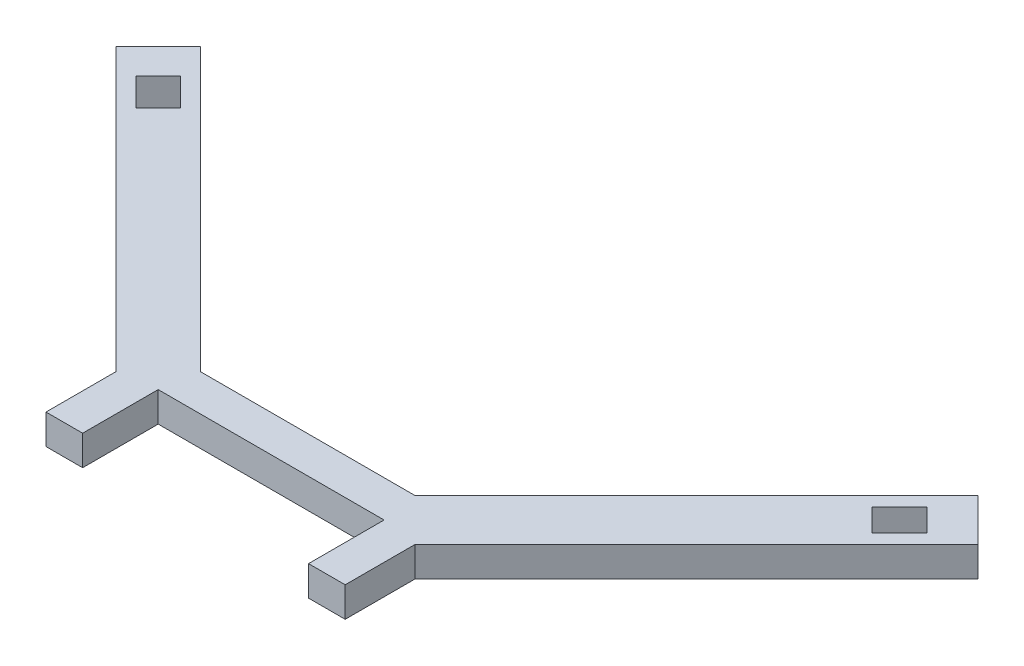
ISO-10303-21;
HEADER;
FILE_DESCRIPTION(('STEP AP214'),'2;1');
FILE_NAME('part.step','',(''),(''),'','','');
FILE_SCHEMA(('AUTOMOTIVE_DESIGN { 1 0 10303 214 1 1 1 1 }'));
ENDSEC;
DATA;
#1=APPLICATION_CONTEXT('core data for automotive mechanical design processes');
#2=APPLICATION_PROTOCOL_DEFINITION('international standard','automotive_design',2000,#1);
#3=PRODUCT_CONTEXT('',#1,'mechanical');
#4=PRODUCT('Part','Part','',(#3));
#5=PRODUCT_RELATED_PRODUCT_CATEGORY('part','',(#4));
#6=PRODUCT_DEFINITION_FORMATION('','',#4);
#7=PRODUCT_DEFINITION_CONTEXT('part definition',#1,'design');
#8=PRODUCT_DEFINITION('design','',#6,#7);
#9=PRODUCT_DEFINITION_SHAPE('','',#8);
#10=(LENGTH_UNIT() NAMED_UNIT(*) SI_UNIT(.MILLI.,.METRE.));
#11=(NAMED_UNIT(*) PLANE_ANGLE_UNIT() SI_UNIT($,.RADIAN.));
#12=(NAMED_UNIT(*) SI_UNIT($,.STERADIAN.) SOLID_ANGLE_UNIT());
#13=UNCERTAINTY_MEASURE_WITH_UNIT(LENGTH_MEASURE(1.E-05),#10,'distance_accuracy_value','');
#14=(GEOMETRIC_REPRESENTATION_CONTEXT(3) GLOBAL_UNCERTAINTY_ASSIGNED_CONTEXT((#13)) GLOBAL_UNIT_ASSIGNED_CONTEXT((#10,
#11,#12)) REPRESENTATION_CONTEXT('',''));
#15=CARTESIAN_POINT('',(0.,0.,0.));
#16=DIRECTION('',(0.,0.,1.));
#17=DIRECTION('',(1.,0.,0.));
#18=AXIS2_PLACEMENT_3D('',#15,#16,#17);
#19=CARTESIAN_POINT('',(-5.65685424949234,8.,5.65685424949235));
#20=DIRECTION('',(0.707106781186547,0.,-0.707106781186548));
#21=DIRECTION('',(-0.707106781186548,0.,-0.707106781186547));
#22=AXIS2_PLACEMENT_3D('',#19,#20,#21);
#23=PLANE('',#22);
#24=DIRECTION('',(0.707106781186548,0.,0.707106781186547));
#25=VECTOR('',#24,1.);
#26=CARTESIAN_POINT('',(-5.65685424949234,0.,5.65685424949235));
#27=LINE('',#26,#25);
#28=CARTESIAN_POINT('',(-115.258405333407,0.,-103.944696834423));
#29=VERTEX_POINT('',#28);
#30=CARTESIAN_POINT('',(-40.,0.,-28.6862915010153));
#31=VERTEX_POINT('',#30);
#32=EDGE_CURVE('E272',#29,#31,#27,.T.);
#33=ORIENTED_EDGE('',*,*,#32,.T.);
#34=DIRECTION('',(0.,-1.,0.));
#35=VECTOR('',#34,1.);
#36=CARTESIAN_POINT('',(-40.,8.,-28.6862915010153));
#37=LINE('',#36,#35);
#38=CARTESIAN_POINT('',(-40.,8.,-28.6862915010153));
#39=VERTEX_POINT('',#38);
#40=EDGE_CURVE('E48',#39,#31,#37,.T.);
#41=ORIENTED_EDGE('',*,*,#40,.F.);
#42=DIRECTION('',(0.707106781186548,0.,0.707106781186547));
#43=VECTOR('',#42,1.);
#44=CARTESIAN_POINT('',(-5.65685424949234,8.,5.65685424949235));
#45=LINE('',#44,#43);
#46=CARTESIAN_POINT('',(-115.258405333407,8.,-103.944696834423));
#47=VERTEX_POINT('',#46);
#48=EDGE_CURVE('E238',#47,#39,#45,.T.);
#49=ORIENTED_EDGE('',*,*,#48,.F.);
#50=DIRECTION('',(0.,-1.,0.));
#51=VECTOR('',#50,1.);
#52=CARTESIAN_POINT('',(-115.258405333407,8.,-103.944696834423));
#53=LINE('',#52,#51);
#54=EDGE_CURVE('E239',#47,#29,#53,.T.);
#55=ORIENTED_EDGE('',*,*,#54,.T.);
#56=EDGE_LOOP('',(#33,#41,#49,#55));
#57=FACE_BOUND('',#56,.T.);
#58=ADVANCED_FACE('F41',(#57),#23,.F.);
#59=CARTESIAN_POINT('',(-40.,8.,0.));
#60=DIRECTION('',(1.,0.,0.));
#61=DIRECTION('',(0.,0.,-1.));
#62=AXIS2_PLACEMENT_3D('',#59,#60,#61);
#63=PLANE('',#62);
#64=DIRECTION('',(0.,0.,1.));
#65=VECTOR('',#64,1.);
#66=CARTESIAN_POINT('',(-40.,0.,0.));
#67=LINE('',#66,#65);
#68=CARTESIAN_POINT('',(-40.,0.,-9.99999999999999));
#69=VERTEX_POINT('',#68);
#70=EDGE_CURVE('E221',#31,#69,#67,.T.);
#71=ORIENTED_EDGE('',*,*,#70,.T.);
#72=DIRECTION('',(0.,-1.,0.));
#73=VECTOR('',#72,1.);
#74=CARTESIAN_POINT('',(-40.,8.,-9.99999999999999));
#75=LINE('',#74,#73);
#76=CARTESIAN_POINT('',(-40.,8.,-9.99999999999999));
#77=VERTEX_POINT('',#76);
#78=EDGE_CURVE('E259',#77,#69,#75,.T.);
#79=ORIENTED_EDGE('',*,*,#78,.F.);
#80=DIRECTION('',(0.,0.,1.));
#81=VECTOR('',#80,1.);
#82=CARTESIAN_POINT('',(-40.,8.,0.));
#83=LINE('',#82,#81);
#84=EDGE_CURVE('E267',#39,#77,#83,.T.);
#85=ORIENTED_EDGE('',*,*,#84,.F.);
#86=ORIENTED_EDGE('',*,*,#40,.T.);
#87=EDGE_LOOP('',(#71,#79,#85,#86));
#88=FACE_BOUND('',#87,.T.);
#89=ADVANCED_FACE('F265',(#88),#63,.F.);
#90=CARTESIAN_POINT('',(0.,8.,-9.99999999999999));
#91=DIRECTION('',(0.,0.,-1.));
#92=DIRECTION('',(-1.,0.,0.));
#93=AXIS2_PLACEMENT_3D('',#90,#91,#92);
#94=PLANE('',#93);
#95=DIRECTION('',(1.,0.,0.));
#96=VECTOR('',#95,1.);
#97=CARTESIAN_POINT('',(0.,0.,-9.99999999999999));
#98=LINE('',#97,#96);
#99=CARTESIAN_POINT('',(-30.2,0.,-9.99999999999999));
#100=VERTEX_POINT('',#99);
#101=EDGE_CURVE('E216',#69,#100,#98,.T.);
#102=ORIENTED_EDGE('',*,*,#101,.T.);
#103=DIRECTION('',(0.,1.,0.));
#104=VECTOR('',#103,1.);
#105=CARTESIAN_POINT('',(-30.2,8.,-9.99999999999999));
#106=LINE('',#105,#104);
#107=CARTESIAN_POINT('',(-30.2,8.,-9.99999999999999));
#108=VERTEX_POINT('',#107);
#109=EDGE_CURVE('E363',#100,#108,#106,.T.);
#110=ORIENTED_EDGE('',*,*,#109,.T.);
#111=DIRECTION('',(1.,0.,0.));
#112=VECTOR('',#111,1.);
#113=CARTESIAN_POINT('',(0.,8.,-9.99999999999999));
#114=LINE('',#113,#112);
#115=EDGE_CURVE('E298',#77,#108,#114,.T.);
#116=ORIENTED_EDGE('',*,*,#115,.F.);
#117=ORIENTED_EDGE('',*,*,#78,.T.);
#118=EDGE_LOOP('',(#102,#110,#116,#117));
#119=FACE_BOUND('',#118,.T.);
#120=ADVANCED_FACE('F373',(#119),#94,.F.);
#121=CARTESIAN_POINT('',(0.,8.,-9.99999999999999));
#122=DIRECTION('',(0.,0.,-1.));
#123=DIRECTION('',(-1.,0.,0.));
#124=AXIS2_PLACEMENT_3D('',#121,#122,#123);
#125=PLANE('',#124);
#126=DIRECTION('',(1.,0.,0.));
#127=VECTOR('',#126,1.);
#128=CARTESIAN_POINT('',(0.,8.,-9.99999999999999));
#129=LINE('',#128,#127);
#130=CARTESIAN_POINT('',(30.2,8.,-9.99999999999999));
#131=VERTEX_POINT('',#130);
#132=CARTESIAN_POINT('',(40.,8.,-9.99999999999999));
#133=VERTEX_POINT('',#132);
#134=EDGE_CURVE('E296',#131,#133,#129,.T.);
#135=ORIENTED_EDGE('',*,*,#134,.F.);
#136=DIRECTION('',(0.,-1.,0.));
#137=VECTOR('',#136,1.);
#138=CARTESIAN_POINT('',(30.2,8.,-9.99999999999999));
#139=LINE('',#138,#137);
#140=CARTESIAN_POINT('',(30.2,0.,-9.99999999999999));
#141=VERTEX_POINT('',#140);
#142=EDGE_CURVE('E329',#131,#141,#139,.T.);
#143=ORIENTED_EDGE('',*,*,#142,.T.);
#144=DIRECTION('',(1.,0.,0.));
#145=VECTOR('',#144,1.);
#146=CARTESIAN_POINT('',(0.,0.,-9.99999999999999));
#147=LINE('',#146,#145);
#148=CARTESIAN_POINT('',(40.,0.,-9.99999999999999));
#149=VERTEX_POINT('',#148);
#150=EDGE_CURVE('E209',#141,#149,#147,.T.);
#151=ORIENTED_EDGE('',*,*,#150,.T.);
#152=DIRECTION('',(0.,-1.,0.));
#153=VECTOR('',#152,1.);
#154=CARTESIAN_POINT('',(40.,8.,-9.99999999999999));
#155=LINE('',#154,#153);
#156=EDGE_CURVE('E257',#133,#149,#155,.T.);
#157=ORIENTED_EDGE('',*,*,#156,.F.);
#158=EDGE_LOOP('',(#135,#143,#151,#157));
#159=FACE_BOUND('',#158,.T.);
#160=ADVANCED_FACE('F409',(#159),#125,.F.);
#161=CARTESIAN_POINT('',(40.,8.,0.));
#162=DIRECTION('',(-1.,0.,0.));
#163=DIRECTION('',(0.,0.,1.));
#164=AXIS2_PLACEMENT_3D('',#161,#162,#163);
#165=PLANE('',#164);
#166=DIRECTION('',(0.,0.,-1.));
#167=VECTOR('',#166,1.);
#168=CARTESIAN_POINT('',(40.,0.,0.));
#169=LINE('',#168,#167);
#170=CARTESIAN_POINT('',(40.,0.,-28.6862915010152));
#171=VERTEX_POINT('',#170);
#172=EDGE_CURVE('E212',#149,#171,#169,.T.);
#173=ORIENTED_EDGE('',*,*,#172,.T.);
#174=DIRECTION('',(0.,-1.,0.));
#175=VECTOR('',#174,1.);
#176=CARTESIAN_POINT('',(40.,8.,-28.6862915010152));
#177=LINE('',#176,#175);
#178=CARTESIAN_POINT('',(40.,8.,-28.6862915010152));
#179=VERTEX_POINT('',#178);
#180=EDGE_CURVE('E255',#179,#171,#177,.T.);
#181=ORIENTED_EDGE('',*,*,#180,.F.);
#182=DIRECTION('',(0.,0.,-1.));
#183=VECTOR('',#182,1.);
#184=CARTESIAN_POINT('',(40.,8.,0.));
#185=LINE('',#184,#183);
#186=EDGE_CURVE('E294',#133,#179,#185,.T.);
#187=ORIENTED_EDGE('',*,*,#186,.F.);
#188=ORIENTED_EDGE('',*,*,#156,.T.);
#189=EDGE_LOOP('',(#173,#181,#187,#188));
#190=FACE_BOUND('',#189,.T.);
#191=ADVANCED_FACE('F407',(#190),#165,.F.);
#192=CARTESIAN_POINT('',(5.65685424949238,8.,5.65685424949238));
#193=DIRECTION('',(0.707106781186547,0.,0.707106781186547));
#194=DIRECTION('',(0.707106781186548,0.,-0.707106781186548));
#195=AXIS2_PLACEMENT_3D('',#192,#193,#194);
#196=PLANE('',#195);
#197=DIRECTION('',(-0.707106781186548,0.,0.707106781186548));
#198=VECTOR('',#197,1.);
#199=CARTESIAN_POINT('',(5.65685424949238,0.,5.65685424949238));
#200=LINE('',#199,#198);
#201=CARTESIAN_POINT('',(115.258405333407,0.,-103.944696834422));
#202=VERTEX_POINT('',#201);
#203=EDGE_CURVE('E218',#202,#171,#200,.T.);
#204=ORIENTED_EDGE('',*,*,#203,.F.);
#205=DIRECTION('',(0.,-1.,0.));
#206=VECTOR('',#205,1.);
#207=CARTESIAN_POINT('',(115.258405333407,8.,-103.944696834422));
#208=LINE('',#207,#206);
#209=CARTESIAN_POINT('',(115.258405333407,8.,-103.944696834422));
#210=VERTEX_POINT('',#209);
#211=EDGE_CURVE('E253',#210,#202,#208,.T.);
#212=ORIENTED_EDGE('',*,*,#211,.F.);
#213=DIRECTION('',(-0.707106781186548,0.,0.707106781186548));
#214=VECTOR('',#213,1.);
#215=CARTESIAN_POINT('',(5.65685424949238,8.,5.65685424949238));
#216=LINE('',#215,#214);
#217=EDGE_CURVE('E291',#210,#179,#216,.T.);
#218=ORIENTED_EDGE('',*,*,#217,.T.);
#219=ORIENTED_EDGE('',*,*,#180,.T.);
#220=EDGE_LOOP('',(#204,#212,#218,#219));
#221=FACE_BOUND('',#220,.T.);
#222=ADVANCED_FACE('F403',(#221),#196,.T.);
#223=CARTESIAN_POINT('',(109.601551083915,8.,-109.601551083915));
#224=DIRECTION('',(0.707106781186547,0.,-0.707106781186548));
#225=DIRECTION('',(-0.707106781186548,0.,-0.707106781186547));
#226=AXIS2_PLACEMENT_3D('',#223,#224,#225);
#227=PLANE('',#226);
#228=DIRECTION('',(0.707106781186548,0.,0.707106781186547));
#229=VECTOR('',#228,1.);
#230=CARTESIAN_POINT('',(109.601551083915,0.,-109.601551083915));
#231=LINE('',#230,#229);
#232=CARTESIAN_POINT('',(103.944696834422,0.,-115.258405333407));
#233=VERTEX_POINT('',#232);
#234=EDGE_CURVE('E226',#233,#202,#231,.T.);
#235=ORIENTED_EDGE('',*,*,#234,.F.);
#236=DIRECTION('',(0.,-1.,0.));
#237=VECTOR('',#236,1.);
#238=CARTESIAN_POINT('',(103.944696834422,8.,-115.258405333407));
#239=LINE('',#238,#237);
#240=CARTESIAN_POINT('',(103.944696834422,8.,-115.258405333407));
#241=VERTEX_POINT('',#240);
#242=EDGE_CURVE('E251',#241,#233,#239,.T.);
#243=ORIENTED_EDGE('',*,*,#242,.F.);
#244=DIRECTION('',(0.707106781186548,0.,0.707106781186547));
#245=VECTOR('',#244,1.);
#246=CARTESIAN_POINT('',(109.601551083915,8.,-109.601551083915));
#247=LINE('',#246,#245);
#248=EDGE_CURVE('E288',#241,#210,#247,.T.);
#249=ORIENTED_EDGE('',*,*,#248,.T.);
#250=ORIENTED_EDGE('',*,*,#211,.T.);
#251=EDGE_LOOP('',(#235,#243,#249,#250));
#252=FACE_BOUND('',#251,.T.);
#253=ADVANCED_FACE('F399',(#252),#227,.T.);
#254=CARTESIAN_POINT('',(-5.65685424949238,8.,-5.65685424949238));
#255=DIRECTION('',(-0.707106781186547,0.,-0.707106781186547));
#256=DIRECTION('',(-0.707106781186548,0.,0.707106781186548));
#257=AXIS2_PLACEMENT_3D('',#254,#255,#256);
#258=PLANE('',#257);
#259=DIRECTION('',(0.707106781186548,0.,-0.707106781186548));
#260=VECTOR('',#259,1.);
#261=CARTESIAN_POINT('',(-5.65685424949238,0.,-5.65685424949238));
#262=LINE('',#261,#260);
#263=CARTESIAN_POINT('',(28.6862915010152,0.,-40.));
#264=VERTEX_POINT('',#263);
#265=EDGE_CURVE('E229',#264,#233,#262,.T.);
#266=ORIENTED_EDGE('',*,*,#265,.F.);
#267=DIRECTION('',(0.,-1.,0.));
#268=VECTOR('',#267,1.);
#269=CARTESIAN_POINT('',(28.6862915010152,8.,-40.));
#270=LINE('',#269,#268);
#271=CARTESIAN_POINT('',(28.6862915010152,8.,-40.));
#272=VERTEX_POINT('',#271);
#273=EDGE_CURVE('E249',#272,#264,#270,.T.);
#274=ORIENTED_EDGE('',*,*,#273,.F.);
#275=DIRECTION('',(0.707106781186548,0.,-0.707106781186548));
#276=VECTOR('',#275,1.);
#277=CARTESIAN_POINT('',(-5.65685424949238,8.,-5.65685424949238));
#278=LINE('',#277,#276);
#279=EDGE_CURVE('E285',#272,#241,#278,.T.);
#280=ORIENTED_EDGE('',*,*,#279,.T.);
#281=ORIENTED_EDGE('',*,*,#242,.T.);
#282=EDGE_LOOP('',(#266,#274,#280,#281));
#283=FACE_BOUND('',#282,.T.);
#284=ADVANCED_FACE('F395',(#283),#258,.T.);
#285=CARTESIAN_POINT('',(0.,8.,-40.));
#286=DIRECTION('',(0.,0.,1.));
#287=DIRECTION('',(1.,0.,0.));
#288=AXIS2_PLACEMENT_3D('',#285,#286,#287);
#289=PLANE('',#288);
#290=DIRECTION('',(-1.,0.,0.));
#291=VECTOR('',#290,1.);
#292=CARTESIAN_POINT('',(0.,0.,-40.));
#293=LINE('',#292,#291);
#294=CARTESIAN_POINT('',(-28.6862915010153,0.,-40.));
#295=VERTEX_POINT('',#294);
#296=EDGE_CURVE('E232',#264,#295,#293,.T.);
#297=ORIENTED_EDGE('',*,*,#296,.T.);
#298=DIRECTION('',(0.,-1.,0.));
#299=VECTOR('',#298,1.);
#300=CARTESIAN_POINT('',(-28.6862915010153,8.,-40.));
#301=LINE('',#300,#299);
#302=CARTESIAN_POINT('',(-28.6862915010153,8.,-40.));
#303=VERTEX_POINT('',#302);
#304=EDGE_CURVE('E246',#303,#295,#301,.T.);
#305=ORIENTED_EDGE('',*,*,#304,.F.);
#306=DIRECTION('',(-1.,0.,0.));
#307=VECTOR('',#306,1.);
#308=CARTESIAN_POINT('',(0.,8.,-40.));
#309=LINE('',#308,#307);
#310=EDGE_CURVE('E283',#272,#303,#309,.T.);
#311=ORIENTED_EDGE('',*,*,#310,.F.);
#312=ORIENTED_EDGE('',*,*,#273,.T.);
#313=EDGE_LOOP('',(#297,#305,#311,#312));
#314=FACE_BOUND('',#313,.T.);
#315=ADVANCED_FACE('F392',(#314),#289,.F.);
#316=CARTESIAN_POINT('',(5.65685424949237,8.,-5.65685424949237));
#317=DIRECTION('',(-0.707106781186548,0.,0.707106781186547));
#318=DIRECTION('',(0.707106781186547,0.,0.707106781186548));
#319=AXIS2_PLACEMENT_3D('',#316,#317,#318);
#320=PLANE('',#319);
#321=DIRECTION('',(-0.707106781186547,0.,-0.707106781186548));
#322=VECTOR('',#321,1.);
#323=CARTESIAN_POINT('',(5.65685424949237,0.,-5.65685424949237));
#324=LINE('',#323,#322);
#325=CARTESIAN_POINT('',(-103.944696834422,0.,-115.258405333407));
#326=VERTEX_POINT('',#325);
#327=EDGE_CURVE('E234',#295,#326,#324,.T.);
#328=ORIENTED_EDGE('',*,*,#327,.T.);
#329=DIRECTION('',(0.,-1.,0.));
#330=VECTOR('',#329,1.);
#331=CARTESIAN_POINT('',(-103.944696834422,8.,-115.258405333407));
#332=LINE('',#331,#330);
#333=CARTESIAN_POINT('',(-103.944696834422,8.,-115.258405333407));
#334=VERTEX_POINT('',#333);
#335=EDGE_CURVE('E242',#334,#326,#332,.T.);
#336=ORIENTED_EDGE('',*,*,#335,.F.);
#337=DIRECTION('',(-0.707106781186547,0.,-0.707106781186548));
#338=VECTOR('',#337,1.);
#339=CARTESIAN_POINT('',(5.65685424949237,8.,-5.65685424949237));
#340=LINE('',#339,#338);
#341=EDGE_CURVE('E281',#303,#334,#340,.T.);
#342=ORIENTED_EDGE('',*,*,#341,.F.);
#343=ORIENTED_EDGE('',*,*,#304,.T.);
#344=EDGE_LOOP('',(#328,#336,#342,#343));
#345=FACE_BOUND('',#344,.T.);
#346=ADVANCED_FACE('F388',(#345),#320,.F.);
#347=CARTESIAN_POINT('',(-109.601551083915,8.,-109.601551083915));
#348=DIRECTION('',(0.707106781186548,0.,0.707106781186547));
#349=DIRECTION('',(0.707106781186547,0.,-0.707106781186548));
#350=AXIS2_PLACEMENT_3D('',#347,#348,#349);
#351=PLANE('',#350);
#352=DIRECTION('',(-0.707106781186547,0.,0.707106781186548));
#353=VECTOR('',#352,1.);
#354=CARTESIAN_POINT('',(-109.601551083915,0.,-109.601551083915));
#355=LINE('',#354,#353);
#356=EDGE_CURVE('E236',#326,#29,#355,.T.);
#357=ORIENTED_EDGE('',*,*,#356,.T.);
#358=ORIENTED_EDGE('',*,*,#54,.F.);
#359=DIRECTION('',(-0.707106781186547,0.,0.707106781186548));
#360=VECTOR('',#359,1.);
#361=CARTESIAN_POINT('',(-109.601551083915,8.,-109.601551083915));
#362=LINE('',#361,#360);
#363=EDGE_CURVE('E243',#334,#47,#362,.T.);
#364=ORIENTED_EDGE('',*,*,#363,.F.);
#365=ORIENTED_EDGE('',*,*,#335,.T.);
#366=EDGE_LOOP('',(#357,#358,#364,#365));
#367=FACE_BOUND('',#366,.T.);
#368=ADVANCED_FACE('F383',(#367),#351,.F.);
#369=CARTESIAN_POINT('',(0.,8.,0.));
#370=DIRECTION('',(0.,1.,0.));
#371=DIRECTION('',(0.,0.,1.));
#372=AXIS2_PLACEMENT_3D('',#369,#370,#371);
#373=PLANE('',#372);
#374=DIRECTION('',(0.,0.,-1.));
#375=VECTOR('',#374,1.);
#376=CARTESIAN_POINT('',(30.2,8.,30.2));
#377=LINE('',#376,#375);
#378=CARTESIAN_POINT('',(30.2,8.,-30.2));
#379=VERTEX_POINT('',#378);
#380=EDGE_CURVE('E193',#131,#379,#377,.T.);
#381=ORIENTED_EDGE('',*,*,#380,.F.);
#382=ORIENTED_EDGE('',*,*,#134,.T.);
#383=ORIENTED_EDGE('',*,*,#186,.T.);
#384=ORIENTED_EDGE('',*,*,#217,.F.);
#385=ORIENTED_EDGE('',*,*,#248,.F.);
#386=ORIENTED_EDGE('',*,*,#279,.F.);
#387=ORIENTED_EDGE('',*,*,#310,.T.);
#388=ORIENTED_EDGE('',*,*,#341,.T.);
#389=ORIENTED_EDGE('',*,*,#363,.T.);
#390=ORIENTED_EDGE('',*,*,#48,.T.);
#391=ORIENTED_EDGE('',*,*,#84,.T.);
#392=ORIENTED_EDGE('',*,*,#115,.T.);
#393=DIRECTION('',(0.,0.,1.));
#394=VECTOR('',#393,1.);
#395=CARTESIAN_POINT('',(-30.2,8.,30.2));
#396=LINE('',#395,#394);
#397=CARTESIAN_POINT('',(-30.2,8.,-30.2));
#398=VERTEX_POINT('',#397);
#399=EDGE_CURVE('E203',#398,#108,#396,.T.);
#400=ORIENTED_EDGE('',*,*,#399,.F.);
#401=DIRECTION('',(-1.,0.,0.));
#402=VECTOR('',#401,1.);
#403=CARTESIAN_POINT('',(-30.2,8.,-30.2));
#404=LINE('',#403,#402);
#405=EDGE_CURVE('E368',#379,#398,#404,.T.);
#406=ORIENTED_EDGE('',*,*,#405,.F.);
#407=EDGE_LOOP('',(#381,#382,#383,#384,#385,#386,#387,#388,#389,#390,#391,#392,#400,#406));
#408=FACE_BOUND('',#407,.T.);
#409=DIRECTION('',(-0.707106781186548,0.,-0.707106781186548));
#410=VECTOR('',#409,1.);
#411=CARTESIAN_POINT('',(2.9698484809835,8.,-2.9698484809835));
#412=LINE('',#411,#410);
#413=CARTESIAN_POINT('',(-92.4895669792004,8.,-98.4292639411674));
#414=VERTEX_POINT('',#413);
#415=CARTESIAN_POINT('',(-99.8434775035405,8.,-105.783174465507));
#416=VERTEX_POINT('',#415);
#417=EDGE_CURVE('E63',#414,#416,#412,.T.);
#418=ORIENTED_EDGE('',*,*,#417,.F.);
#419=DIRECTION('',(0.707106781186548,0.,-0.707106781186548));
#420=VECTOR('',#419,1.);
#421=CARTESIAN_POINT('',(-95.4594154601839,8.,-95.4594154601839));
#422=LINE('',#421,#420);
#423=CARTESIAN_POINT('',(-98.4292639411674,8.,-92.4895669792004));
#424=VERTEX_POINT('',#423);
#425=EDGE_CURVE('E341',#424,#414,#422,.T.);
#426=ORIENTED_EDGE('',*,*,#425,.F.);
#427=DIRECTION('',(-0.707106781186548,0.,-0.707106781186547));
#428=VECTOR('',#427,1.);
#429=CARTESIAN_POINT('',(-2.96984848098342,8.,2.96984848098342));
#430=LINE('',#429,#428);
#431=CARTESIAN_POINT('',(-105.783174465508,8.,-99.8434775035405));
#432=VERTEX_POINT('',#431);
#433=EDGE_CURVE('E345',#424,#432,#430,.T.);
#434=ORIENTED_EDGE('',*,*,#433,.T.);
#435=DIRECTION('',(-0.707106781186548,0.,0.707106781186548));
#436=VECTOR('',#435,1.);
#437=CARTESIAN_POINT('',(-102.813325984524,8.,-102.813325984524));
#438=LINE('',#437,#436);
#439=EDGE_CURVE('E348',#416,#432,#438,.T.);
#440=ORIENTED_EDGE('',*,*,#439,.F.);
#441=EDGE_LOOP('',(#418,#426,#434,#440));
#442=FACE_BOUND('',#441,.T.);
#443=DIRECTION('',(0.707106781186547,0.,-0.707106781186547));
#444=VECTOR('',#443,1.);
#445=CARTESIAN_POINT('',(98.4292639411674,8.,-92.4895669792004));
#446=LINE('',#445,#444);
#447=CARTESIAN_POINT('',(98.4292639411674,8.,-92.4895669792004));
#448=VERTEX_POINT('',#447);
#449=CARTESIAN_POINT('',(105.783174465507,8.,-99.8434775035405));
#450=VERTEX_POINT('',#449);
#451=EDGE_CURVE('E316',#448,#450,#446,.T.);
#452=ORIENTED_EDGE('',*,*,#451,.F.);
#453=DIRECTION('',(0.707106781186548,0.,0.707106781186548));
#454=VECTOR('',#453,1.);
#455=CARTESIAN_POINT('',(92.4895669792004,8.,-98.4292639411674));
#456=LINE('',#455,#454);
#457=CARTESIAN_POINT('',(92.4895669792004,8.,-98.4292639411674));
#458=VERTEX_POINT('',#457);
#459=EDGE_CURVE('E306',#458,#448,#456,.T.);
#460=ORIENTED_EDGE('',*,*,#459,.F.);
#461=DIRECTION('',(0.707106781186547,0.,-0.707106781186547));
#462=VECTOR('',#461,1.);
#463=CARTESIAN_POINT('',(92.4895669792004,8.,-98.4292639411674));
#464=LINE('',#463,#462);
#465=CARTESIAN_POINT('',(99.8434775035405,8.,-105.783174465507));
#466=VERTEX_POINT('',#465);
#467=EDGE_CURVE('E321',#458,#466,#464,.T.);
#468=ORIENTED_EDGE('',*,*,#467,.T.);
#469=DIRECTION('',(0.707106781186548,0.,0.707106781186548));
#470=VECTOR('',#469,1.);
#471=CARTESIAN_POINT('',(99.8434775035405,8.,-105.783174465507));
#472=LINE('',#471,#470);
#473=EDGE_CURVE('E318',#466,#450,#472,.T.);
#474=ORIENTED_EDGE('',*,*,#473,.T.);
#475=EDGE_LOOP('',(#452,#460,#468,#474));
#476=FACE_BOUND('',#475,.T.);
#477=ADVANCED_FACE('F377',(#408,#442,#476),#373,.T.);
#478=CARTESIAN_POINT('',(0.,0.,0.));
#479=DIRECTION('',(0.,1.,0.));
#480=DIRECTION('',(0.,0.,1.));
#481=AXIS2_PLACEMENT_3D('',#478,#479,#480);
#482=PLANE('',#481);
#483=ORIENTED_EDGE('',*,*,#150,.F.);
#484=DIRECTION('',(0.,0.,-1.));
#485=VECTOR('',#484,1.);
#486=CARTESIAN_POINT('',(30.2,0.,0.));
#487=LINE('',#486,#485);
#488=CARTESIAN_POINT('',(30.2,0.,-30.2));
#489=VERTEX_POINT('',#488);
#490=EDGE_CURVE('E11',#141,#489,#487,.T.);
#491=ORIENTED_EDGE('',*,*,#490,.T.);
#492=DIRECTION('',(-1.,0.,0.));
#493=VECTOR('',#492,1.);
#494=CARTESIAN_POINT('',(-30.2,0.,-30.2));
#495=LINE('',#494,#493);
#496=CARTESIAN_POINT('',(-30.2,0.,-30.2));
#497=VERTEX_POINT('',#496);
#498=EDGE_CURVE('E200',#489,#497,#495,.T.);
#499=ORIENTED_EDGE('',*,*,#498,.T.);
#500=DIRECTION('',(0.,0.,1.));
#501=VECTOR('',#500,1.);
#502=CARTESIAN_POINT('',(-30.2,0.,30.2));
#503=LINE('',#502,#501);
#504=EDGE_CURVE('E55',#497,#100,#503,.T.);
#505=ORIENTED_EDGE('',*,*,#504,.T.);
#506=ORIENTED_EDGE('',*,*,#101,.F.);
#507=ORIENTED_EDGE('',*,*,#70,.F.);
#508=ORIENTED_EDGE('',*,*,#32,.F.);
#509=ORIENTED_EDGE('',*,*,#356,.F.);
#510=ORIENTED_EDGE('',*,*,#327,.F.);
#511=ORIENTED_EDGE('',*,*,#296,.F.);
#512=ORIENTED_EDGE('',*,*,#265,.T.);
#513=ORIENTED_EDGE('',*,*,#234,.T.);
#514=ORIENTED_EDGE('',*,*,#203,.T.);
#515=ORIENTED_EDGE('',*,*,#172,.F.);
#516=EDGE_LOOP('',(#483,#491,#499,#505,#506,#507,#508,#509,#510,#511,#512,#513,#514,#515));
#517=FACE_BOUND('',#516,.T.);
#518=DIRECTION('',(0.707106781186548,0.,-0.707106781186548));
#519=VECTOR('',#518,1.);
#520=CARTESIAN_POINT('',(-95.4594154601839,0.,-95.4594154601839));
#521=LINE('',#520,#519);
#522=CARTESIAN_POINT('',(-98.4292639411674,0.,-92.4895669792004));
#523=VERTEX_POINT('',#522);
#524=CARTESIAN_POINT('',(-92.4895669792004,0.,-98.4292639411674));
#525=VERTEX_POINT('',#524);
#526=EDGE_CURVE('E338',#523,#525,#521,.T.);
#527=ORIENTED_EDGE('',*,*,#526,.T.);
#528=DIRECTION('',(-0.707106781186548,0.,-0.707106781186548));
#529=VECTOR('',#528,1.);
#530=CARTESIAN_POINT('',(2.9698484809835,0.,-2.9698484809835));
#531=LINE('',#530,#529);
#532=CARTESIAN_POINT('',(-99.8434775035405,0.,-105.783174465508));
#533=VERTEX_POINT('',#532);
#534=EDGE_CURVE('E344',#525,#533,#531,.T.);
#535=ORIENTED_EDGE('',*,*,#534,.T.);
#536=DIRECTION('',(-0.707106781186548,0.,0.707106781186548));
#537=VECTOR('',#536,1.);
#538=CARTESIAN_POINT('',(-102.813325984524,0.,-102.813325984524));
#539=LINE('',#538,#537);
#540=CARTESIAN_POINT('',(-105.783174465507,0.,-99.8434775035405));
#541=VERTEX_POINT('',#540);
#542=EDGE_CURVE('E357',#533,#541,#539,.T.);
#543=ORIENTED_EDGE('',*,*,#542,.T.);
#544=DIRECTION('',(-0.707106781186548,0.,-0.707106781186547));
#545=VECTOR('',#544,1.);
#546=CARTESIAN_POINT('',(-2.96984848098342,0.,2.96984848098342));
#547=LINE('',#546,#545);
#548=EDGE_CURVE('E354',#523,#541,#547,.T.);
#549=ORIENTED_EDGE('',*,*,#548,.F.);
#550=EDGE_LOOP('',(#527,#535,#543,#549));
#551=FACE_BOUND('',#550,.T.);
#552=DIRECTION('',(0.707106781186548,0.,0.707106781186548));
#553=VECTOR('',#552,1.);
#554=CARTESIAN_POINT('',(92.4895669792004,0.,-98.4292639411674));
#555=LINE('',#554,#553);
#556=CARTESIAN_POINT('',(92.4895669792004,0.,-98.4292639411674));
#557=VERTEX_POINT('',#556);
#558=CARTESIAN_POINT('',(98.4292639411674,0.,-92.4895669792004));
#559=VERTEX_POINT('',#558);
#560=EDGE_CURVE('E312',#557,#559,#555,.T.);
#561=ORIENTED_EDGE('',*,*,#560,.T.);
#562=DIRECTION('',(0.707106781186547,0.,-0.707106781186547));
#563=VECTOR('',#562,1.);
#564=CARTESIAN_POINT('',(98.4292639411674,0.,-92.4895669792004));
#565=LINE('',#564,#563);
#566=CARTESIAN_POINT('',(105.783174465507,0.,-99.8434775035405));
#567=VERTEX_POINT('',#566);
#568=EDGE_CURVE('E303',#559,#567,#565,.T.);
#569=ORIENTED_EDGE('',*,*,#568,.T.);
#570=DIRECTION('',(0.707106781186548,0.,0.707106781186548));
#571=VECTOR('',#570,1.);
#572=CARTESIAN_POINT('',(99.8434775035405,0.,-105.783174465507));
#573=LINE('',#572,#571);
#574=CARTESIAN_POINT('',(99.8434775035405,0.,-105.783174465507));
#575=VERTEX_POINT('',#574);
#576=EDGE_CURVE('E307',#575,#567,#573,.T.);
#577=ORIENTED_EDGE('',*,*,#576,.F.);
#578=DIRECTION('',(0.707106781186547,0.,-0.707106781186547));
#579=VECTOR('',#578,1.);
#580=CARTESIAN_POINT('',(92.4895669792004,0.,-98.4292639411674));
#581=LINE('',#580,#579);
#582=EDGE_CURVE('E309',#557,#575,#581,.T.);
#583=ORIENTED_EDGE('',*,*,#582,.F.);
#584=EDGE_LOOP('',(#561,#569,#577,#583));
#585=FACE_BOUND('',#584,.T.);
#586=ADVANCED_FACE('F206',(#517,#551,#585),#482,.F.);
#587=CARTESIAN_POINT('',(98.4292639411674,0.,-92.4895669792004));
#588=DIRECTION('',(0.707106781186547,0.,0.707106781186547));
#589=DIRECTION('',(0.707106781186548,0.,-0.707106781186548));
#590=AXIS2_PLACEMENT_3D('',#587,#588,#589);
#591=PLANE('',#590);
#592=ORIENTED_EDGE('',*,*,#451,.T.);
#593=DIRECTION('',(0.,1.,0.));
#594=VECTOR('',#593,1.);
#595=CARTESIAN_POINT('',(105.783174465507,0.,-99.8434775035405));
#596=LINE('',#595,#594);
#597=EDGE_CURVE('E315',#567,#450,#596,.T.);
#598=ORIENTED_EDGE('',*,*,#597,.F.);
#599=ORIENTED_EDGE('',*,*,#568,.F.);
#600=DIRECTION('',(0.,1.,0.));
#601=VECTOR('',#600,1.);
#602=CARTESIAN_POINT('',(98.4292639411674,0.,-92.4895669792004));
#603=LINE('',#602,#601);
#604=EDGE_CURVE('E326',#559,#448,#603,.T.);
#605=ORIENTED_EDGE('',*,*,#604,.T.);
#606=EDGE_LOOP('',(#592,#598,#599,#605));
#607=FACE_BOUND('',#606,.T.);
#608=ADVANCED_FACE('F478',(#607),#591,.F.);
#609=CARTESIAN_POINT('',(92.4895669792004,0.,-98.4292639411674));
#610=DIRECTION('',(-0.707106781186547,0.,0.707106781186547));
#611=DIRECTION('',(0.707106781186548,0.,0.707106781186548));
#612=AXIS2_PLACEMENT_3D('',#609,#610,#611);
#613=PLANE('',#612);
#614=ORIENTED_EDGE('',*,*,#459,.T.);
#615=ORIENTED_EDGE('',*,*,#604,.F.);
#616=ORIENTED_EDGE('',*,*,#560,.F.);
#617=DIRECTION('',(0.,1.,0.));
#618=VECTOR('',#617,1.);
#619=CARTESIAN_POINT('',(92.4895669792004,0.,-98.4292639411674));
#620=LINE('',#619,#618);
#621=EDGE_CURVE('E328',#557,#458,#620,.T.);
#622=ORIENTED_EDGE('',*,*,#621,.T.);
#623=EDGE_LOOP('',(#614,#615,#616,#622));
#624=FACE_BOUND('',#623,.T.);
#625=ADVANCED_FACE('F482',(#624),#613,.F.);
#626=CARTESIAN_POINT('',(92.4895669792004,0.,-98.4292639411674));
#627=DIRECTION('',(0.707106781186547,0.,0.707106781186547));
#628=DIRECTION('',(0.707106781186548,0.,-0.707106781186548));
#629=AXIS2_PLACEMENT_3D('',#626,#627,#628);
#630=PLANE('',#629);
#631=ORIENTED_EDGE('',*,*,#467,.F.);
#632=ORIENTED_EDGE('',*,*,#621,.F.);
#633=ORIENTED_EDGE('',*,*,#582,.T.);
#634=DIRECTION('',(0.,1.,0.));
#635=VECTOR('',#634,1.);
#636=CARTESIAN_POINT('',(99.8434775035405,0.,-105.783174465507));
#637=LINE('',#636,#635);
#638=EDGE_CURVE('E331',#575,#466,#637,.T.);
#639=ORIENTED_EDGE('',*,*,#638,.T.);
#640=EDGE_LOOP('',(#631,#632,#633,#639));
#641=FACE_BOUND('',#640,.T.);
#642=ADVANCED_FACE('F492',(#641),#630,.T.);
#643=CARTESIAN_POINT('',(99.8434775035405,0.,-105.783174465507));
#644=DIRECTION('',(-0.707106781186547,0.,0.707106781186547));
#645=DIRECTION('',(0.707106781186548,0.,0.707106781186548));
#646=AXIS2_PLACEMENT_3D('',#643,#644,#645);
#647=PLANE('',#646);
#648=ORIENTED_EDGE('',*,*,#473,.F.);
#649=ORIENTED_EDGE('',*,*,#638,.F.);
#650=ORIENTED_EDGE('',*,*,#576,.T.);
#651=ORIENTED_EDGE('',*,*,#597,.T.);
#652=EDGE_LOOP('',(#648,#649,#650,#651));
#653=FACE_BOUND('',#652,.T.);
#654=ADVANCED_FACE('F501',(#653),#647,.T.);
#655=CARTESIAN_POINT('',(2.9698484809835,0.,-2.9698484809835));
#656=DIRECTION('',(0.707106781186547,0.,-0.707106781186547));
#657=DIRECTION('',(-0.707106781186548,0.,-0.707106781186548));
#658=AXIS2_PLACEMENT_3D('',#655,#656,#657);
#659=PLANE('',#658);
#660=ORIENTED_EDGE('',*,*,#417,.T.);
#661=DIRECTION('',(0.,1.,0.));
#662=VECTOR('',#661,1.);
#663=CARTESIAN_POINT('',(-99.8434775035405,0.,-105.783174465508));
#664=LINE('',#663,#662);
#665=EDGE_CURVE('E335',#533,#416,#664,.T.);
#666=ORIENTED_EDGE('',*,*,#665,.F.);
#667=ORIENTED_EDGE('',*,*,#534,.F.);
#668=DIRECTION('',(0.,1.,0.));
#669=VECTOR('',#668,1.);
#670=CARTESIAN_POINT('',(-92.4895669792004,0.,-98.4292639411674));
#671=LINE('',#670,#669);
#672=EDGE_CURVE('E275',#525,#414,#671,.T.);
#673=ORIENTED_EDGE('',*,*,#672,.T.);
#674=EDGE_LOOP('',(#660,#666,#667,#673));
#675=FACE_BOUND('',#674,.T.);
#676=ADVANCED_FACE('F510',(#675),#659,.F.);
#677=CARTESIAN_POINT('',(-95.4594154601839,0.,-95.4594154601839));
#678=DIRECTION('',(0.707106781186547,0.,0.707106781186547));
#679=DIRECTION('',(0.707106781186548,0.,-0.707106781186548));
#680=AXIS2_PLACEMENT_3D('',#677,#678,#679);
#681=PLANE('',#680);
#682=ORIENTED_EDGE('',*,*,#425,.T.);
#683=ORIENTED_EDGE('',*,*,#672,.F.);
#684=ORIENTED_EDGE('',*,*,#526,.F.);
#685=DIRECTION('',(0.,1.,0.));
#686=VECTOR('',#685,1.);
#687=CARTESIAN_POINT('',(-98.4292639411674,0.,-92.4895669792004));
#688=LINE('',#687,#686);
#689=EDGE_CURVE('E277',#523,#424,#688,.T.);
#690=ORIENTED_EDGE('',*,*,#689,.T.);
#691=EDGE_LOOP('',(#682,#683,#684,#690));
#692=FACE_BOUND('',#691,.T.);
#693=ADVANCED_FACE('F519',(#692),#681,.F.);
#694=CARTESIAN_POINT('',(-2.96984848098342,0.,2.96984848098342));
#695=DIRECTION('',(0.707106781186547,0.,-0.707106781186548));
#696=DIRECTION('',(-0.707106781186548,0.,-0.707106781186547));
#697=AXIS2_PLACEMENT_3D('',#694,#695,#696);
#698=PLANE('',#697);
#699=ORIENTED_EDGE('',*,*,#433,.F.);
#700=ORIENTED_EDGE('',*,*,#689,.F.);
#701=ORIENTED_EDGE('',*,*,#548,.T.);
#702=DIRECTION('',(0.,1.,0.));
#703=VECTOR('',#702,1.);
#704=CARTESIAN_POINT('',(-105.783174465508,0.,-99.8434775035405));
#705=LINE('',#704,#703);
#706=EDGE_CURVE('E337',#541,#432,#705,.T.);
#707=ORIENTED_EDGE('',*,*,#706,.T.);
#708=EDGE_LOOP('',(#699,#700,#701,#707));
#709=FACE_BOUND('',#708,.T.);
#710=ADVANCED_FACE('F528',(#709),#698,.T.);
#711=CARTESIAN_POINT('',(-102.813325984524,0.,-102.813325984524));
#712=DIRECTION('',(-0.707106781186547,0.,-0.707106781186547));
#713=DIRECTION('',(-0.707106781186548,0.,0.707106781186548));
#714=AXIS2_PLACEMENT_3D('',#711,#712,#713);
#715=PLANE('',#714);
#716=ORIENTED_EDGE('',*,*,#439,.T.);
#717=ORIENTED_EDGE('',*,*,#706,.F.);
#718=ORIENTED_EDGE('',*,*,#542,.F.);
#719=ORIENTED_EDGE('',*,*,#665,.T.);
#720=EDGE_LOOP('',(#716,#717,#718,#719));
#721=FACE_BOUND('',#720,.T.);
#722=ADVANCED_FACE('F536',(#721),#715,.F.);
#723=CARTESIAN_POINT('',(30.2,0.,30.2));
#724=DIRECTION('',(1.,0.,0.));
#725=DIRECTION('',(0.,0.,-1.));
#726=AXIS2_PLACEMENT_3D('',#723,#724,#725);
#727=PLANE('',#726);
#728=ORIENTED_EDGE('',*,*,#380,.T.);
#729=DIRECTION('',(0.,1.,0.));
#730=VECTOR('',#729,1.);
#731=CARTESIAN_POINT('',(30.2,0.,-30.2));
#732=LINE('',#731,#730);
#733=EDGE_CURVE('E188',#489,#379,#732,.T.);
#734=ORIENTED_EDGE('',*,*,#733,.F.);
#735=ORIENTED_EDGE('',*,*,#490,.F.);
#736=ORIENTED_EDGE('',*,*,#142,.F.);
#737=EDGE_LOOP('',(#728,#734,#735,#736));
#738=FACE_BOUND('',#737,.T.);
#739=ADVANCED_FACE('F190',(#738),#727,.F.);
#740=CARTESIAN_POINT('',(-30.2,0.,30.2));
#741=DIRECTION('',(-1.,0.,0.));
#742=DIRECTION('',(0.,0.,1.));
#743=AXIS2_PLACEMENT_3D('',#740,#741,#742);
#744=PLANE('',#743);
#745=ORIENTED_EDGE('',*,*,#504,.F.);
#746=DIRECTION('',(0.,1.,0.));
#747=VECTOR('',#746,1.);
#748=CARTESIAN_POINT('',(-30.2,0.,-30.2));
#749=LINE('',#748,#747);
#750=EDGE_CURVE('E197',#497,#398,#749,.T.);
#751=ORIENTED_EDGE('',*,*,#750,.T.);
#752=ORIENTED_EDGE('',*,*,#399,.T.);
#753=ORIENTED_EDGE('',*,*,#109,.F.);
#754=EDGE_LOOP('',(#745,#751,#752,#753));
#755=FACE_BOUND('',#754,.T.);
#756=ADVANCED_FACE('F596',(#755),#744,.F.);
#757=CARTESIAN_POINT('',(-30.2,0.,-30.2));
#758=DIRECTION('',(0.,0.,-1.));
#759=DIRECTION('',(-1.,0.,0.));
#760=AXIS2_PLACEMENT_3D('',#757,#758,#759);
#761=PLANE('',#760);
#762=ORIENTED_EDGE('',*,*,#405,.T.);
#763=ORIENTED_EDGE('',*,*,#750,.F.);
#764=ORIENTED_EDGE('',*,*,#498,.F.);
#765=ORIENTED_EDGE('',*,*,#733,.T.);
#766=EDGE_LOOP('',(#762,#763,#764,#765));
#767=FACE_BOUND('',#766,.T.);
#768=ADVANCED_FACE('F201',(#767),#761,.F.);
#769=CLOSED_SHELL('',(#58,#89,#120,#160,#191,#222,#253,#284,#315,#346,#368,#477,#586,#608,#625,
#642,#654,#676,#693,#710,#722,#739,#756,#768));
#770=MANIFOLD_SOLID_BREP('B2',#769);
#771=ADVANCED_BREP_SHAPE_REPRESENTATION('',(#18,#770),#14);
#772=SHAPE_DEFINITION_REPRESENTATION(#9,#771);
ENDSEC;
END-ISO-10303-21;
